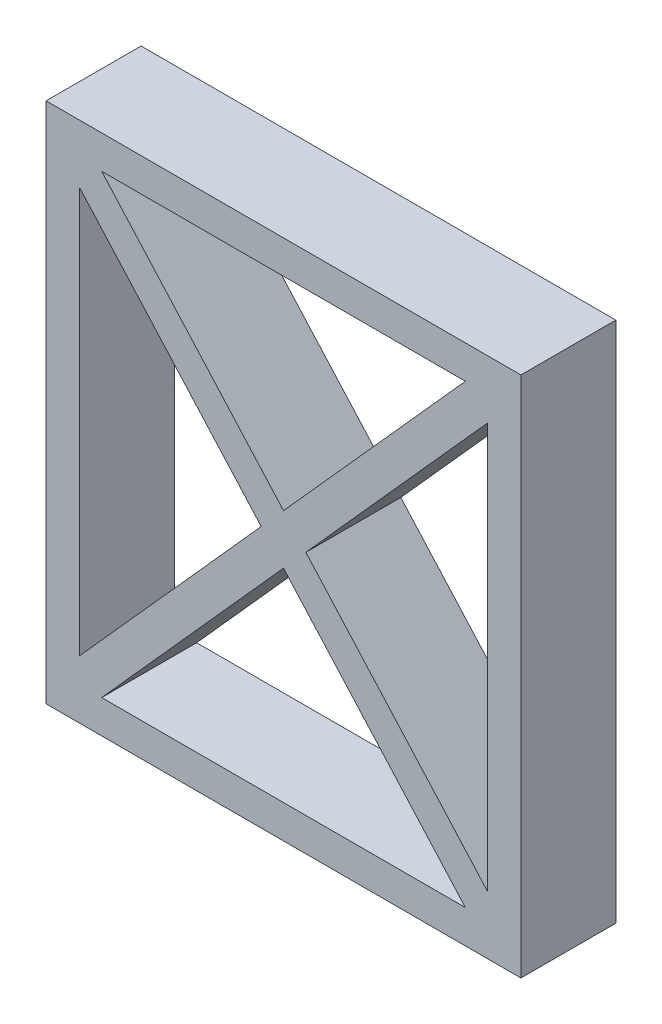
ISO-10303-21;
HEADER;
FILE_DESCRIPTION(('STEP AP214'),'2;1');
FILE_NAME('part.step','',(''),(''),'','','');
FILE_SCHEMA(('AUTOMOTIVE_DESIGN { 1 0 10303 214 1 1 1 1 }'));
ENDSEC;
DATA;
#1=APPLICATION_CONTEXT('core data for automotive mechanical design processes');
#2=APPLICATION_PROTOCOL_DEFINITION('international standard','automotive_design',2000,#1);
#3=PRODUCT_CONTEXT('',#1,'mechanical');
#4=PRODUCT('Part','Part','',(#3));
#5=PRODUCT_RELATED_PRODUCT_CATEGORY('part','',(#4));
#6=PRODUCT_DEFINITION_FORMATION('','',#4);
#7=PRODUCT_DEFINITION_CONTEXT('part definition',#1,'design');
#8=PRODUCT_DEFINITION('design','',#6,#7);
#9=PRODUCT_DEFINITION_SHAPE('','',#8);
#10=(LENGTH_UNIT() NAMED_UNIT(*) SI_UNIT(.MILLI.,.METRE.));
#11=(NAMED_UNIT(*) PLANE_ANGLE_UNIT() SI_UNIT($,.RADIAN.));
#12=(NAMED_UNIT(*) SI_UNIT($,.STERADIAN.) SOLID_ANGLE_UNIT());
#13=UNCERTAINTY_MEASURE_WITH_UNIT(LENGTH_MEASURE(1.E-05),#10,'distance_accuracy_value','');
#14=(GEOMETRIC_REPRESENTATION_CONTEXT(3) GLOBAL_UNCERTAINTY_ASSIGNED_CONTEXT((#13)) GLOBAL_UNIT_ASSIGNED_CONTEXT((#10,
#11,#12)) REPRESENTATION_CONTEXT('',''));
#15=CARTESIAN_POINT('',(0.,0.,0.));
#16=DIRECTION('',(0.,0.,1.));
#17=DIRECTION('',(1.,0.,0.));
#18=AXIS2_PLACEMENT_3D('',#15,#16,#17);
#19=CARTESIAN_POINT('',(0.,0.,20.));
#20=DIRECTION('',(0.,0.,-1.));
#21=DIRECTION('',(-1.,0.,0.));
#22=AXIS2_PLACEMENT_3D('',#19,#20,#21);
#23=PLANE('',#22);
#24=DIRECTION('',(-0.667248321585259,0.74483533572304,0.));
#25=VECTOR('',#24,1.);
#26=CARTESIAN_POINT('',(-43.0000000000013,-12.2454234604662,20.));
#27=LINE('',#26,#25);
#28=CARTESIAN_POINT('',(-4.69902518333601,-54.9999999999972,20.));
#29=VERTEX_POINT('',#28);
#30=CARTESIAN_POINT('',(-43.0000000000013,-12.2454234604662,20.));
#31=VERTEX_POINT('',#30);
#32=EDGE_CURVE('E174',#29,#31,#27,.T.);
#33=ORIENTED_EDGE('',*,*,#32,.F.);
#34=DIRECTION('',(0.667248321585257,0.744835335723042,0.));
#35=VECTOR('',#34,1.);
#36=CARTESIAN_POINT('',(-4.69902518333601,-54.9999999999972,20.));
#37=LINE('',#36,#35);
#38=CARTESIAN_POINT('',(-43.0000000000013,-97.7545765395285,20.));
#39=VERTEX_POINT('',#38);
#40=EDGE_CURVE('E181',#39,#29,#37,.T.);
#41=ORIENTED_EDGE('',*,*,#40,.F.);
#42=DIRECTION('',(0.,-1.,0.));
#43=VECTOR('',#42,1.);
#44=CARTESIAN_POINT('',(-43.0000000000013,-12.2454234604662,20.));
#45=LINE('',#44,#43);
#46=EDGE_CURVE('E176',#31,#39,#45,.T.);
#47=ORIENTED_EDGE('',*,*,#46,.F.);
#48=EDGE_LOOP('',(#33,#41,#47));
#49=FACE_BOUND('',#48,.T.);
#50=DIRECTION('',(0.66724832158526,-0.74483533572304,0.));
#51=VECTOR('',#50,1.);
#52=CARTESIAN_POINT('',(-38.3009748166668,-7.00000000000001,20.));
#53=LINE('',#52,#51);
#54=CARTESIAN_POINT('',(-38.3009748166668,-7.00000000000001,20.));
#55=VERTEX_POINT('',#54);
#56=CARTESIAN_POINT('',(-1.47451495458029E-12,-49.754576539531,20.));
#57=VERTEX_POINT('',#56);
#58=EDGE_CURVE('E224',#55,#57,#53,.T.);
#59=ORIENTED_EDGE('',*,*,#58,.F.);
#60=DIRECTION('',(-1.,0.,0.));
#61=VECTOR('',#60,1.);
#62=CARTESIAN_POINT('',(38.3009748166636,-7.,20.));
#63=LINE('',#62,#61);
#64=CARTESIAN_POINT('',(38.3009748166636,-7.,20.));
#65=VERTEX_POINT('',#64);
#66=EDGE_CURVE('E231',#65,#55,#63,.T.);
#67=ORIENTED_EDGE('',*,*,#66,.F.);
#68=DIRECTION('',(0.667248321585258,0.744835335723042,0.));
#69=VECTOR('',#68,1.);
#70=CARTESIAN_POINT('',(38.3009748166636,-7.,20.));
#71=LINE('',#70,#69);
#72=EDGE_CURVE('E226',#57,#65,#71,.T.);
#73=ORIENTED_EDGE('',*,*,#72,.F.);
#74=EDGE_LOOP('',(#59,#67,#73));
#75=FACE_BOUND('',#74,.T.);
#76=DIRECTION('',(0.,-1.,0.));
#77=VECTOR('',#76,1.);
#78=CARTESIAN_POINT('',(-50.0000000000013,-109.999999999995,20.));
#79=LINE('',#78,#77);
#80=CARTESIAN_POINT('',(-49.9999999999997,5.29437604868122E-12,20.));
#81=VERTEX_POINT('',#80);
#82=CARTESIAN_POINT('',(-50.0000000000013,-109.999999999995,20.));
#83=VERTEX_POINT('',#82);
#84=EDGE_CURVE('E249',#81,#83,#79,.T.);
#85=ORIENTED_EDGE('',*,*,#84,.T.);
#86=DIRECTION('',(1.,0.,0.));
#87=VECTOR('',#86,1.);
#88=CARTESIAN_POINT('',(49.9999999999986,-109.999999999995,20.));
#89=LINE('',#88,#87);
#90=CARTESIAN_POINT('',(49.9999999999986,-109.999999999995,20.));
#91=VERTEX_POINT('',#90);
#92=EDGE_CURVE('E252',#83,#91,#89,.T.);
#93=ORIENTED_EDGE('',*,*,#92,.T.);
#94=DIRECTION('',(0.,1.,0.));
#95=VECTOR('',#94,1.);
#96=CARTESIAN_POINT('',(50.0000000000003,5.39499001028787E-12,20.));
#97=LINE('',#96,#95);
#98=CARTESIAN_POINT('',(50.0000000000003,5.39499001028787E-12,20.));
#99=VERTEX_POINT('',#98);
#100=EDGE_CURVE('E256',#91,#99,#97,.T.);
#101=ORIENTED_EDGE('',*,*,#100,.T.);
#102=DIRECTION('',(-1.,0.,0.));
#103=VECTOR('',#102,1.);
#104=CARTESIAN_POINT('',(-49.9999999999997,5.29437604868122E-12,20.));
#105=LINE('',#104,#103);
#106=EDGE_CURVE('E258',#99,#81,#105,.T.);
#107=ORIENTED_EDGE('',*,*,#106,.T.);
#108=EDGE_LOOP('',(#85,#93,#101,#107));
#109=FACE_BOUND('',#108,.T.);
#110=DIRECTION('',(0.66724832158526,-0.74483533572304,0.));
#111=VECTOR('',#110,1.);
#112=CARTESIAN_POINT('',(4.69902518333305,-54.9999999999972,20.));
#113=LINE('',#112,#111);
#114=CARTESIAN_POINT('',(4.69902518333305,-54.9999999999972,20.));
#115=VERTEX_POINT('',#114);
#116=CARTESIAN_POINT('',(42.9999999999986,-97.7545765395286,20.));
#117=VERTEX_POINT('',#116);
#118=EDGE_CURVE('E200',#115,#117,#113,.T.);
#119=ORIENTED_EDGE('',*,*,#118,.F.);
#120=DIRECTION('',(-0.667248321585258,-0.744835335723042,0.));
#121=VECTOR('',#120,1.);
#122=CARTESIAN_POINT('',(42.9999999999986,-12.2454234604656,20.));
#123=LINE('',#122,#121);
#124=CARTESIAN_POINT('',(42.9999999999986,-12.2454234604656,20.));
#125=VERTEX_POINT('',#124);
#126=EDGE_CURVE('E206',#125,#115,#123,.T.);
#127=ORIENTED_EDGE('',*,*,#126,.F.);
#128=DIRECTION('',(0.,1.,0.));
#129=VECTOR('',#128,1.);
#130=CARTESIAN_POINT('',(42.9999999999986,-97.7545765395286,20.));
#131=LINE('',#130,#129);
#132=EDGE_CURVE('E202',#117,#125,#131,.T.);
#133=ORIENTED_EDGE('',*,*,#132,.F.);
#134=EDGE_LOOP('',(#119,#127,#133));
#135=FACE_BOUND('',#134,.T.);
#136=DIRECTION('',(-0.66724832158526,0.74483533572304,0.));
#137=VECTOR('',#136,1.);
#138=CARTESIAN_POINT('',(-1.46887710328336E-12,-60.2454234604634,20.));
#139=LINE('',#138,#137);
#140=CARTESIAN_POINT('',(38.3009748166641,-102.999999999995,20.));
#141=VERTEX_POINT('',#140);
#142=CARTESIAN_POINT('',(-1.46887710328336E-12,-60.2454234604634,20.));
#143=VERTEX_POINT('',#142);
#144=EDGE_CURVE('E147',#141,#143,#139,.T.);
#145=ORIENTED_EDGE('',*,*,#144,.F.);
#146=DIRECTION('',(1.,0.,0.));
#147=VECTOR('',#146,1.);
#148=CARTESIAN_POINT('',(-38.3009748166668,-102.999999999995,20.));
#149=LINE('',#148,#147);
#150=CARTESIAN_POINT('',(-38.3009748166668,-102.999999999995,20.));
#151=VERTEX_POINT('',#150);
#152=EDGE_CURVE('E164',#151,#141,#149,.T.);
#153=ORIENTED_EDGE('',*,*,#152,.F.);
#154=DIRECTION('',(-0.667248321585257,-0.744835335723042,0.));
#155=VECTOR('',#154,1.);
#156=CARTESIAN_POINT('',(-1.46887710328336E-12,-60.2454234604634,20.));
#157=LINE('',#156,#155);
#158=EDGE_CURVE('E155',#143,#151,#157,.T.);
#159=ORIENTED_EDGE('',*,*,#158,.F.);
#160=EDGE_LOOP('',(#145,#153,#159));
#161=FACE_BOUND('',#160,.T.);
#162=ADVANCED_FACE('F34',(#49,#75,#109,#135,#161),#23,.F.);
#163=CARTESIAN_POINT('',(0.,0.,0.));
#164=DIRECTION('',(0.,0.,-1.));
#165=DIRECTION('',(-1.,0.,0.));
#166=AXIS2_PLACEMENT_3D('',#163,#164,#165);
#167=PLANE('',#166);
#168=DIRECTION('',(0.,-1.,0.));
#169=VECTOR('',#168,1.);
#170=CARTESIAN_POINT('',(-50.0000000000013,-109.999999999995,0.));
#171=LINE('',#170,#169);
#172=CARTESIAN_POINT('',(-49.9999999999997,5.29437604868122E-12,0.));
#173=VERTEX_POINT('',#172);
#174=CARTESIAN_POINT('',(-50.0000000000013,-109.999999999995,0.));
#175=VERTEX_POINT('',#174);
#176=EDGE_CURVE('E248',#173,#175,#171,.T.);
#177=ORIENTED_EDGE('',*,*,#176,.F.);
#178=DIRECTION('',(-1.,0.,0.));
#179=VECTOR('',#178,1.);
#180=CARTESIAN_POINT('',(-49.9999999999997,5.29437604868122E-12,0.));
#181=LINE('',#180,#179);
#182=CARTESIAN_POINT('',(50.0000000000003,5.39499001028787E-12,0.));
#183=VERTEX_POINT('',#182);
#184=EDGE_CURVE('E253',#183,#173,#181,.T.);
#185=ORIENTED_EDGE('',*,*,#184,.F.);
#186=DIRECTION('',(0.,1.,0.));
#187=VECTOR('',#186,1.);
#188=CARTESIAN_POINT('',(50.0000000000003,5.39499001028787E-12,0.));
#189=LINE('',#188,#187);
#190=CARTESIAN_POINT('',(49.9999999999986,-109.999999999995,0.));
#191=VERTEX_POINT('',#190);
#192=EDGE_CURVE('E266',#191,#183,#189,.T.);
#193=ORIENTED_EDGE('',*,*,#192,.F.);
#194=DIRECTION('',(1.,0.,0.));
#195=VECTOR('',#194,1.);
#196=CARTESIAN_POINT('',(49.9999999999986,-109.999999999995,0.));
#197=LINE('',#196,#195);
#198=EDGE_CURVE('E263',#175,#191,#197,.T.);
#199=ORIENTED_EDGE('',*,*,#198,.F.);
#200=EDGE_LOOP('',(#177,#185,#193,#199));
#201=FACE_BOUND('',#200,.T.);
#202=DIRECTION('',(-1.,0.,0.));
#203=VECTOR('',#202,1.);
#204=CARTESIAN_POINT('',(38.3009748166636,-7.,0.));
#205=LINE('',#204,#203);
#206=CARTESIAN_POINT('',(38.3009748166636,-7.,0.));
#207=VERTEX_POINT('',#206);
#208=CARTESIAN_POINT('',(-38.3009748166668,-7.00000000000001,0.));
#209=VERTEX_POINT('',#208);
#210=EDGE_CURVE('E227',#207,#209,#205,.T.);
#211=ORIENTED_EDGE('',*,*,#210,.T.);
#212=DIRECTION('',(0.66724832158526,-0.74483533572304,0.));
#213=VECTOR('',#212,1.);
#214=CARTESIAN_POINT('',(-38.3009748166668,-7.00000000000001,0.));
#215=LINE('',#214,#213);
#216=CARTESIAN_POINT('',(-1.47451495458029E-12,-49.754576539531,0.));
#217=VERTEX_POINT('',#216);
#218=EDGE_CURVE('E223',#209,#217,#215,.T.);
#219=ORIENTED_EDGE('',*,*,#218,.T.);
#220=DIRECTION('',(0.667248321585258,0.744835335723042,0.));
#221=VECTOR('',#220,1.);
#222=CARTESIAN_POINT('',(38.3009748166636,-7.,0.));
#223=LINE('',#222,#221);
#224=EDGE_CURVE('E236',#217,#207,#223,.T.);
#225=ORIENTED_EDGE('',*,*,#224,.T.);
#226=EDGE_LOOP('',(#211,#219,#225));
#227=FACE_BOUND('',#226,.T.);
#228=DIRECTION('',(-0.667248321585258,-0.744835335723042,0.));
#229=VECTOR('',#228,1.);
#230=CARTESIAN_POINT('',(42.9999999999986,-12.2454234604656,0.));
#231=LINE('',#230,#229);
#232=CARTESIAN_POINT('',(42.9999999999986,-12.2454234604656,0.));
#233=VERTEX_POINT('',#232);
#234=CARTESIAN_POINT('',(4.69902518333305,-54.9999999999972,0.));
#235=VERTEX_POINT('',#234);
#236=EDGE_CURVE('E203',#233,#235,#231,.T.);
#237=ORIENTED_EDGE('',*,*,#236,.T.);
#238=DIRECTION('',(0.66724832158526,-0.74483533572304,0.));
#239=VECTOR('',#238,1.);
#240=CARTESIAN_POINT('',(4.69902518333305,-54.9999999999972,0.));
#241=LINE('',#240,#239);
#242=CARTESIAN_POINT('',(42.9999999999986,-97.7545765395286,0.));
#243=VERTEX_POINT('',#242);
#244=EDGE_CURVE('E199',#235,#243,#241,.T.);
#245=ORIENTED_EDGE('',*,*,#244,.T.);
#246=DIRECTION('',(0.,1.,0.));
#247=VECTOR('',#246,1.);
#248=CARTESIAN_POINT('',(42.9999999999986,-97.7545765395286,0.));
#249=LINE('',#248,#247);
#250=EDGE_CURVE('E211',#243,#233,#249,.T.);
#251=ORIENTED_EDGE('',*,*,#250,.T.);
#252=EDGE_LOOP('',(#237,#245,#251));
#253=FACE_BOUND('',#252,.T.);
#254=DIRECTION('',(0.667248321585257,0.744835335723042,0.));
#255=VECTOR('',#254,1.);
#256=CARTESIAN_POINT('',(-4.69902518333601,-54.9999999999972,0.));
#257=LINE('',#256,#255);
#258=CARTESIAN_POINT('',(-43.0000000000013,-97.7545765395285,0.));
#259=VERTEX_POINT('',#258);
#260=CARTESIAN_POINT('',(-4.699025183336,-54.9999999999972,0.));
#261=VERTEX_POINT('',#260);
#262=EDGE_CURVE('E177',#259,#261,#257,.T.);
#263=ORIENTED_EDGE('',*,*,#262,.T.);
#264=DIRECTION('',(-0.667248321585259,0.74483533572304,0.));
#265=VECTOR('',#264,1.);
#266=CARTESIAN_POINT('',(-43.0000000000013,-12.2454234604662,0.));
#267=LINE('',#266,#265);
#268=CARTESIAN_POINT('',(-43.0000000000013,-12.2454234604662,0.));
#269=VERTEX_POINT('',#268);
#270=EDGE_CURVE('E162',#261,#269,#267,.T.);
#271=ORIENTED_EDGE('',*,*,#270,.T.);
#272=DIRECTION('',(0.,-1.,0.));
#273=VECTOR('',#272,1.);
#274=CARTESIAN_POINT('',(-43.0000000000013,-12.2454234604662,0.));
#275=LINE('',#274,#273);
#276=EDGE_CURVE('E186',#269,#259,#275,.T.);
#277=ORIENTED_EDGE('',*,*,#276,.T.);
#278=EDGE_LOOP('',(#263,#271,#277));
#279=FACE_BOUND('',#278,.T.);
#280=DIRECTION('',(1.,0.,0.));
#281=VECTOR('',#280,1.);
#282=CARTESIAN_POINT('',(-38.3009748166668,-102.999999999995,0.));
#283=LINE('',#282,#281);
#284=CARTESIAN_POINT('',(-38.3009748166668,-102.999999999995,0.));
#285=VERTEX_POINT('',#284);
#286=CARTESIAN_POINT('',(38.3009748166641,-102.999999999995,0.));
#287=VERTEX_POINT('',#286);
#288=EDGE_CURVE('E156',#285,#287,#283,.T.);
#289=ORIENTED_EDGE('',*,*,#288,.T.);
#290=DIRECTION('',(-0.66724832158526,0.74483533572304,0.));
#291=VECTOR('',#290,1.);
#292=CARTESIAN_POINT('',(-1.46887710328336E-12,-60.2454234604634,0.));
#293=LINE('',#292,#291);
#294=CARTESIAN_POINT('',(-1.46887710328336E-12,-60.2454234604634,0.));
#295=VERTEX_POINT('',#294);
#296=EDGE_CURVE('E57',#287,#295,#293,.T.);
#297=ORIENTED_EDGE('',*,*,#296,.T.);
#298=DIRECTION('',(-0.667248321585257,-0.744835335723042,0.));
#299=VECTOR('',#298,1.);
#300=CARTESIAN_POINT('',(-1.46887710328336E-12,-60.2454234604634,0.));
#301=LINE('',#300,#299);
#302=EDGE_CURVE('E161',#295,#285,#301,.T.);
#303=ORIENTED_EDGE('',*,*,#302,.T.);
#304=EDGE_LOOP('',(#289,#297,#303));
#305=FACE_BOUND('',#304,.T.);
#306=ADVANCED_FACE('F284',(#201,#227,#253,#279,#305),#167,.T.);
#307=CARTESIAN_POINT('',(-50.0000000000013,-109.999999999995,20.));
#308=DIRECTION('',(1.,0.,0.));
#309=DIRECTION('',(0.,1.,0.));
#310=AXIS2_PLACEMENT_3D('',#307,#308,#309);
#311=PLANE('',#310);
#312=ORIENTED_EDGE('',*,*,#176,.T.);
#313=DIRECTION('',(0.,0.,-1.));
#314=VECTOR('',#313,1.);
#315=CARTESIAN_POINT('',(-50.0000000000013,-109.999999999995,20.));
#316=LINE('',#315,#314);
#317=EDGE_CURVE('E11',#83,#175,#316,.T.);
#318=ORIENTED_EDGE('',*,*,#317,.F.);
#319=ORIENTED_EDGE('',*,*,#84,.F.);
#320=DIRECTION('',(0.,0.,-1.));
#321=VECTOR('',#320,1.);
#322=CARTESIAN_POINT('',(-49.9999999999997,5.29437604868122E-12,20.));
#323=LINE('',#322,#321);
#324=EDGE_CURVE('E260',#81,#173,#323,.T.);
#325=ORIENTED_EDGE('',*,*,#324,.T.);
#326=EDGE_LOOP('',(#312,#318,#319,#325));
#327=FACE_BOUND('',#326,.T.);
#328=ADVANCED_FACE('F36',(#327),#311,.F.);
#329=CARTESIAN_POINT('',(49.9999999999986,-109.999999999995,20.));
#330=DIRECTION('',(0.,1.,0.));
#331=DIRECTION('',(0.,0.,1.));
#332=AXIS2_PLACEMENT_3D('',#329,#330,#331);
#333=PLANE('',#332);
#334=ORIENTED_EDGE('',*,*,#198,.T.);
#335=DIRECTION('',(0.,0.,-1.));
#336=VECTOR('',#335,1.);
#337=CARTESIAN_POINT('',(49.9999999999986,-109.999999999995,20.));
#338=LINE('',#337,#336);
#339=EDGE_CURVE('E42',#91,#191,#338,.T.);
#340=ORIENTED_EDGE('',*,*,#339,.F.);
#341=ORIENTED_EDGE('',*,*,#92,.F.);
#342=ORIENTED_EDGE('',*,*,#317,.T.);
#343=EDGE_LOOP('',(#334,#340,#341,#342));
#344=FACE_BOUND('',#343,.T.);
#345=ADVANCED_FACE('F295',(#344),#333,.F.);
#346=CARTESIAN_POINT('',(50.0000000000003,5.39499001028787E-12,20.));
#347=DIRECTION('',(-1.,0.,0.));
#348=DIRECTION('',(0.,-1.,0.));
#349=AXIS2_PLACEMENT_3D('',#346,#347,#348);
#350=PLANE('',#349);
#351=ORIENTED_EDGE('',*,*,#192,.T.);
#352=DIRECTION('',(0.,0.,-1.));
#353=VECTOR('',#352,1.);
#354=CARTESIAN_POINT('',(50.0000000000003,5.39499001028787E-12,20.));
#355=LINE('',#354,#353);
#356=EDGE_CURVE('E271',#99,#183,#355,.T.);
#357=ORIENTED_EDGE('',*,*,#356,.F.);
#358=ORIENTED_EDGE('',*,*,#100,.F.);
#359=ORIENTED_EDGE('',*,*,#339,.T.);
#360=EDGE_LOOP('',(#351,#357,#358,#359));
#361=FACE_BOUND('',#360,.T.);
#362=ADVANCED_FACE('F278',(#361),#350,.F.);
#363=CARTESIAN_POINT('',(-49.9999999999997,5.29437604868122E-12,20.));
#364=DIRECTION('',(0.,-1.,0.));
#365=DIRECTION('',(1.,0.,0.));
#366=AXIS2_PLACEMENT_3D('',#363,#364,#365);
#367=PLANE('',#366);
#368=ORIENTED_EDGE('',*,*,#184,.T.);
#369=ORIENTED_EDGE('',*,*,#324,.F.);
#370=ORIENTED_EDGE('',*,*,#106,.F.);
#371=ORIENTED_EDGE('',*,*,#356,.T.);
#372=EDGE_LOOP('',(#368,#369,#370,#371));
#373=FACE_BOUND('',#372,.T.);
#374=ADVANCED_FACE('F288',(#373),#367,.F.);
#375=CARTESIAN_POINT('',(-38.3009748166668,-7.00000000000001,20.));
#376=DIRECTION('',(0.74483533572304,0.66724832158526,0.));
#377=DIRECTION('',(-0.66724832158526,0.74483533572304,0.));
#378=AXIS2_PLACEMENT_3D('',#375,#376,#377);
#379=PLANE('',#378);
#380=ORIENTED_EDGE('',*,*,#218,.F.);
#381=DIRECTION('',(0.,0.,-1.));
#382=VECTOR('',#381,1.);
#383=CARTESIAN_POINT('',(-38.3009748166668,-7.00000000000001,20.));
#384=LINE('',#383,#382);
#385=EDGE_CURVE('E233',#55,#209,#384,.T.);
#386=ORIENTED_EDGE('',*,*,#385,.F.);
#387=ORIENTED_EDGE('',*,*,#58,.T.);
#388=DIRECTION('',(0.,0.,-1.));
#389=VECTOR('',#388,1.);
#390=CARTESIAN_POINT('',(-1.47451495458029E-12,-49.754576539531,20.));
#391=LINE('',#390,#389);
#392=EDGE_CURVE('E245',#57,#217,#391,.T.);
#393=ORIENTED_EDGE('',*,*,#392,.T.);
#394=EDGE_LOOP('',(#380,#386,#387,#393));
#395=FACE_BOUND('',#394,.T.);
#396=ADVANCED_FACE('F312',(#395),#379,.T.);
#397=CARTESIAN_POINT('',(38.3009748166636,-7.,20.));
#398=DIRECTION('',(-0.744835335723042,0.667248321585258,0.));
#399=DIRECTION('',(-0.667248321585258,-0.744835335723042,0.));
#400=AXIS2_PLACEMENT_3D('',#397,#398,#399);
#401=PLANE('',#400);
#402=ORIENTED_EDGE('',*,*,#224,.F.);
#403=ORIENTED_EDGE('',*,*,#392,.F.);
#404=ORIENTED_EDGE('',*,*,#72,.T.);
#405=DIRECTION('',(0.,0.,-1.));
#406=VECTOR('',#405,1.);
#407=CARTESIAN_POINT('',(38.3009748166636,-7.,20.));
#408=LINE('',#407,#406);
#409=EDGE_CURVE('E243',#65,#207,#408,.T.);
#410=ORIENTED_EDGE('',*,*,#409,.T.);
#411=EDGE_LOOP('',(#402,#403,#404,#410));
#412=FACE_BOUND('',#411,.T.);
#413=ADVANCED_FACE('F319',(#412),#401,.T.);
#414=CARTESIAN_POINT('',(38.3009748166636,-7.,20.));
#415=DIRECTION('',(0.,-1.,0.));
#416=DIRECTION('',(1.,0.,0.));
#417=AXIS2_PLACEMENT_3D('',#414,#415,#416);
#418=PLANE('',#417);
#419=ORIENTED_EDGE('',*,*,#210,.F.);
#420=ORIENTED_EDGE('',*,*,#409,.F.);
#421=ORIENTED_EDGE('',*,*,#66,.T.);
#422=ORIENTED_EDGE('',*,*,#385,.T.);
#423=EDGE_LOOP('',(#419,#420,#421,#422));
#424=FACE_BOUND('',#423,.T.);
#425=ADVANCED_FACE('F324',(#424),#418,.T.);
#426=CARTESIAN_POINT('',(4.69902518333305,-54.9999999999972,20.));
#427=DIRECTION('',(0.74483533572304,0.66724832158526,0.));
#428=DIRECTION('',(-0.66724832158526,0.74483533572304,0.));
#429=AXIS2_PLACEMENT_3D('',#426,#427,#428);
#430=PLANE('',#429);
#431=ORIENTED_EDGE('',*,*,#244,.F.);
#432=DIRECTION('',(0.,0.,-1.));
#433=VECTOR('',#432,1.);
#434=CARTESIAN_POINT('',(4.69902518333305,-54.9999999999972,20.));
#435=LINE('',#434,#433);
#436=EDGE_CURVE('E208',#115,#235,#435,.T.);
#437=ORIENTED_EDGE('',*,*,#436,.F.);
#438=ORIENTED_EDGE('',*,*,#118,.T.);
#439=DIRECTION('',(0.,0.,-1.));
#440=VECTOR('',#439,1.);
#441=CARTESIAN_POINT('',(42.9999999999986,-97.7545765395286,20.));
#442=LINE('',#441,#440);
#443=EDGE_CURVE('E220',#117,#243,#442,.T.);
#444=ORIENTED_EDGE('',*,*,#443,.T.);
#445=EDGE_LOOP('',(#431,#437,#438,#444));
#446=FACE_BOUND('',#445,.T.);
#447=ADVANCED_FACE('F367',(#446),#430,.T.);
#448=CARTESIAN_POINT('',(42.9999999999986,-97.7545765395286,20.));
#449=DIRECTION('',(-1.,0.,0.));
#450=DIRECTION('',(0.,0.,1.));
#451=AXIS2_PLACEMENT_3D('',#448,#449,#450);
#452=PLANE('',#451);
#453=ORIENTED_EDGE('',*,*,#250,.F.);
#454=ORIENTED_EDGE('',*,*,#443,.F.);
#455=ORIENTED_EDGE('',*,*,#132,.T.);
#456=DIRECTION('',(0.,0.,-1.));
#457=VECTOR('',#456,1.);
#458=CARTESIAN_POINT('',(42.9999999999986,-12.2454234604656,20.));
#459=LINE('',#458,#457);
#460=EDGE_CURVE('E218',#125,#233,#459,.T.);
#461=ORIENTED_EDGE('',*,*,#460,.T.);
#462=EDGE_LOOP('',(#453,#454,#455,#461));
#463=FACE_BOUND('',#462,.T.);
#464=ADVANCED_FACE('F363',(#463),#452,.T.);
#465=CARTESIAN_POINT('',(42.9999999999986,-12.2454234604656,20.));
#466=DIRECTION('',(0.744835335723042,-0.667248321585258,0.));
#467=DIRECTION('',(0.667248321585258,0.744835335723042,0.));
#468=AXIS2_PLACEMENT_3D('',#465,#466,#467);
#469=PLANE('',#468);
#470=ORIENTED_EDGE('',*,*,#236,.F.);
#471=ORIENTED_EDGE('',*,*,#460,.F.);
#472=ORIENTED_EDGE('',*,*,#126,.T.);
#473=ORIENTED_EDGE('',*,*,#436,.T.);
#474=EDGE_LOOP('',(#470,#471,#472,#473));
#475=FACE_BOUND('',#474,.T.);
#476=ADVANCED_FACE('F359',(#475),#469,.T.);
#477=CARTESIAN_POINT('',(-43.0000000000013,-12.2454234604662,20.));
#478=DIRECTION('',(-0.74483533572304,-0.667248321585259,0.));
#479=DIRECTION('',(0.667248321585259,-0.74483533572304,0.));
#480=AXIS2_PLACEMENT_3D('',#477,#478,#479);
#481=PLANE('',#480);
#482=ORIENTED_EDGE('',*,*,#270,.F.);
#483=DIRECTION('',(0.,0.,-1.));
#484=VECTOR('',#483,1.);
#485=CARTESIAN_POINT('',(-4.69902518333601,-54.9999999999972,20.));
#486=LINE('',#485,#484);
#487=EDGE_CURVE('E183',#29,#261,#486,.T.);
#488=ORIENTED_EDGE('',*,*,#487,.F.);
#489=ORIENTED_EDGE('',*,*,#32,.T.);
#490=DIRECTION('',(0.,0.,-1.));
#491=VECTOR('',#490,1.);
#492=CARTESIAN_POINT('',(-43.0000000000013,-12.2454234604662,20.));
#493=LINE('',#492,#491);
#494=EDGE_CURVE('E196',#31,#269,#493,.T.);
#495=ORIENTED_EDGE('',*,*,#494,.T.);
#496=EDGE_LOOP('',(#482,#488,#489,#495));
#497=FACE_BOUND('',#496,.T.);
#498=ADVANCED_FACE('F355',(#497),#481,.T.);
#499=CARTESIAN_POINT('',(-43.0000000000013,-12.2454234604662,20.));
#500=DIRECTION('',(1.,0.,0.));
#501=DIRECTION('',(0.,1.,0.));
#502=AXIS2_PLACEMENT_3D('',#499,#500,#501);
#503=PLANE('',#502);
#504=ORIENTED_EDGE('',*,*,#276,.F.);
#505=ORIENTED_EDGE('',*,*,#494,.F.);
#506=ORIENTED_EDGE('',*,*,#46,.T.);
#507=DIRECTION('',(0.,0.,-1.));
#508=VECTOR('',#507,1.);
#509=CARTESIAN_POINT('',(-43.0000000000013,-97.7545765395285,20.));
#510=LINE('',#509,#508);
#511=EDGE_CURVE('E194',#39,#259,#510,.T.);
#512=ORIENTED_EDGE('',*,*,#511,.T.);
#513=EDGE_LOOP('',(#504,#505,#506,#512));
#514=FACE_BOUND('',#513,.T.);
#515=ADVANCED_FACE('F351',(#514),#503,.T.);
#516=CARTESIAN_POINT('',(-4.69902518333601,-54.9999999999972,20.));
#517=DIRECTION('',(-0.744835335723042,0.667248321585257,0.));
#518=DIRECTION('',(-0.667248321585257,-0.744835335723042,0.));
#519=AXIS2_PLACEMENT_3D('',#516,#517,#518);
#520=PLANE('',#519);
#521=ORIENTED_EDGE('',*,*,#262,.F.);
#522=ORIENTED_EDGE('',*,*,#511,.F.);
#523=ORIENTED_EDGE('',*,*,#40,.T.);
#524=ORIENTED_EDGE('',*,*,#487,.T.);
#525=EDGE_LOOP('',(#521,#522,#523,#524));
#526=FACE_BOUND('',#525,.T.);
#527=ADVANCED_FACE('F348',(#526),#520,.T.);
#528=CARTESIAN_POINT('',(-1.46887710328336E-12,-60.2454234604634,20.));
#529=DIRECTION('',(-0.74483533572304,-0.66724832158526,0.));
#530=DIRECTION('',(0.66724832158526,-0.74483533572304,0.));
#531=AXIS2_PLACEMENT_3D('',#528,#529,#530);
#532=PLANE('',#531);
#533=ORIENTED_EDGE('',*,*,#296,.F.);
#534=DIRECTION('',(0.,0.,-1.));
#535=VECTOR('',#534,1.);
#536=CARTESIAN_POINT('',(38.3009748166641,-102.999999999995,20.));
#537=LINE('',#536,#535);
#538=EDGE_CURVE('E151',#141,#287,#537,.T.);
#539=ORIENTED_EDGE('',*,*,#538,.F.);
#540=ORIENTED_EDGE('',*,*,#144,.T.);
#541=DIRECTION('',(0.,0.,-1.));
#542=VECTOR('',#541,1.);
#543=CARTESIAN_POINT('',(-1.46887710328336E-12,-60.2454234604634,20.));
#544=LINE('',#543,#542);
#545=EDGE_CURVE('E150',#143,#295,#544,.T.);
#546=ORIENTED_EDGE('',*,*,#545,.T.);
#547=EDGE_LOOP('',(#533,#539,#540,#546));
#548=FACE_BOUND('',#547,.T.);
#549=ADVANCED_FACE('F149',(#548),#532,.T.);
#550=CARTESIAN_POINT('',(-1.46887710328336E-12,-60.2454234604634,20.));
#551=DIRECTION('',(0.744835335723042,-0.667248321585257,0.));
#552=DIRECTION('',(0.667248321585258,0.744835335723042,0.));
#553=AXIS2_PLACEMENT_3D('',#550,#551,#552);
#554=PLANE('',#553);
#555=ORIENTED_EDGE('',*,*,#302,.F.);
#556=ORIENTED_EDGE('',*,*,#545,.F.);
#557=ORIENTED_EDGE('',*,*,#158,.T.);
#558=DIRECTION('',(0.,0.,-1.));
#559=VECTOR('',#558,1.);
#560=CARTESIAN_POINT('',(-38.3009748166668,-102.999999999995,20.));
#561=LINE('',#560,#559);
#562=EDGE_CURVE('E49',#151,#285,#561,.T.);
#563=ORIENTED_EDGE('',*,*,#562,.T.);
#564=EDGE_LOOP('',(#555,#556,#557,#563));
#565=FACE_BOUND('',#564,.T.);
#566=ADVANCED_FACE('F159',(#565),#554,.T.);
#567=CARTESIAN_POINT('',(-38.3009748166668,-102.999999999995,20.));
#568=DIRECTION('',(0.,1.,0.));
#569=DIRECTION('',(-1.,0.,0.));
#570=AXIS2_PLACEMENT_3D('',#567,#568,#569);
#571=PLANE('',#570);
#572=ORIENTED_EDGE('',*,*,#288,.F.);
#573=ORIENTED_EDGE('',*,*,#562,.F.);
#574=ORIENTED_EDGE('',*,*,#152,.T.);
#575=ORIENTED_EDGE('',*,*,#538,.T.);
#576=EDGE_LOOP('',(#572,#573,#574,#575));
#577=FACE_BOUND('',#576,.T.);
#578=ADVANCED_FACE('F338',(#577),#571,.T.);
#579=CLOSED_SHELL('',(#162,#306,#328,#345,#362,#374,#396,#413,#425,#447,#464,#476,#498,#515,
#527,#549,#566,#578));
#580=MANIFOLD_SOLID_BREP('B2',#579);
#581=ADVANCED_BREP_SHAPE_REPRESENTATION('',(#18,#580),#14);
#582=SHAPE_DEFINITION_REPRESENTATION(#9,#581);
ENDSEC;
END-ISO-10303-21;
